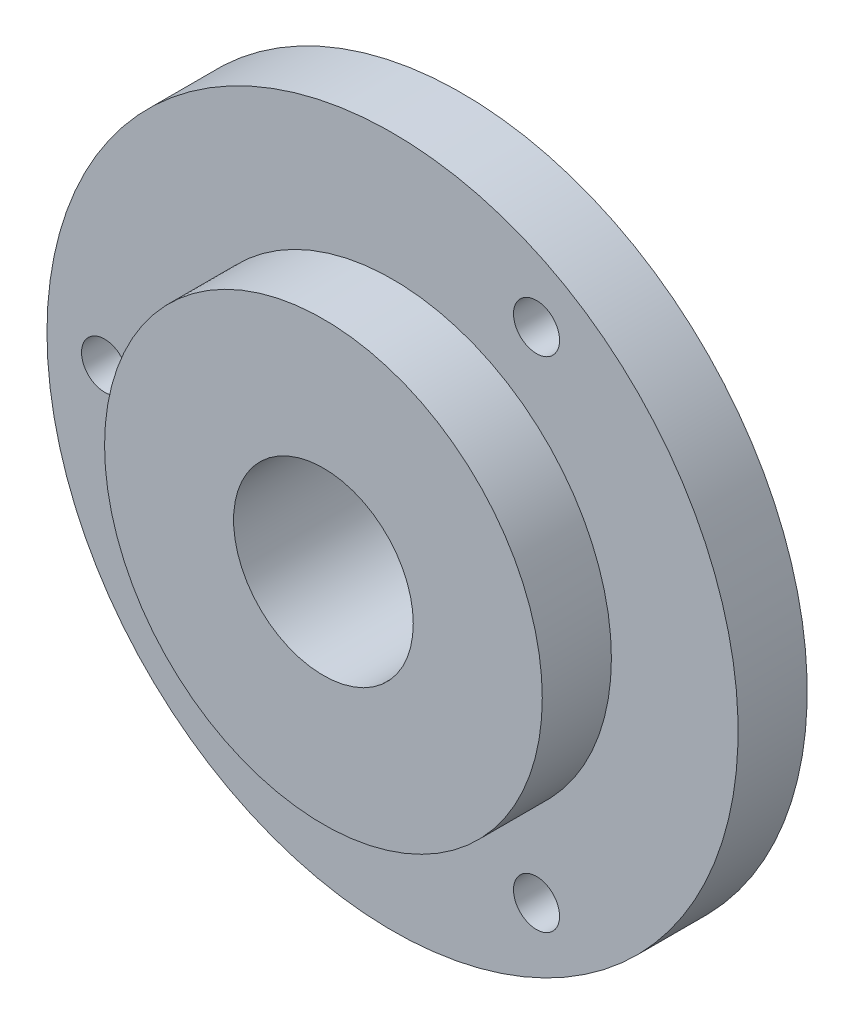
ISO-10303-21;
HEADER;
FILE_DESCRIPTION(('STEP AP214'),'2;1');
FILE_NAME('part.step','',(''),(''),'','','');
FILE_SCHEMA(('AUTOMOTIVE_DESIGN { 1 0 10303 214 1 1 1 1 }'));
ENDSEC;
DATA;
#1=APPLICATION_CONTEXT('core data for automotive mechanical design processes');
#2=APPLICATION_PROTOCOL_DEFINITION('international standard','automotive_design',2000,#1);
#3=PRODUCT_CONTEXT('',#1,'mechanical');
#4=PRODUCT('Part','Part','',(#3));
#5=PRODUCT_RELATED_PRODUCT_CATEGORY('part','',(#4));
#6=PRODUCT_DEFINITION_FORMATION('','',#4);
#7=PRODUCT_DEFINITION_CONTEXT('part definition',#1,'design');
#8=PRODUCT_DEFINITION('design','',#6,#7);
#9=PRODUCT_DEFINITION_SHAPE('','',#8);
#10=(LENGTH_UNIT() NAMED_UNIT(*) SI_UNIT(.MILLI.,.METRE.));
#11=(NAMED_UNIT(*) PLANE_ANGLE_UNIT() SI_UNIT($,.RADIAN.));
#12=(NAMED_UNIT(*) SI_UNIT($,.STERADIAN.) SOLID_ANGLE_UNIT());
#13=UNCERTAINTY_MEASURE_WITH_UNIT(LENGTH_MEASURE(1.E-05),#10,'distance_accuracy_value','');
#14=(GEOMETRIC_REPRESENTATION_CONTEXT(3) GLOBAL_UNCERTAINTY_ASSIGNED_CONTEXT((#13)) GLOBAL_UNIT_ASSIGNED_CONTEXT((#10,
#11,#12)) REPRESENTATION_CONTEXT('',''));
#15=CARTESIAN_POINT('',(0.,0.,0.));
#16=DIRECTION('',(0.,0.,1.));
#17=DIRECTION('',(1.,0.,0.));
#18=AXIS2_PLACEMENT_3D('',#15,#16,#17);
#19=CARTESIAN_POINT('',(0.,0.,3.));
#20=DIRECTION('',(0.,0.,-1.));
#21=DIRECTION('',(-1.,0.,0.));
#22=AXIS2_PLACEMENT_3D('',#19,#20,#21);
#23=CYLINDRICAL_SURFACE('',#22,9.5);
#24=CARTESIAN_POINT('',(0.,0.,3.));
#25=DIRECTION('',(0.,0.,1.));
#26=DIRECTION('',(1.,0.,0.));
#27=AXIS2_PLACEMENT_3D('',#24,#25,#26);
#28=CIRCLE('',#27,9.5);
#29=CARTESIAN_POINT('',(9.5,0.,3.));
#30=VERTEX_POINT('',#29);
#31=EDGE_CURVE('E10',#30,#30,#28,.T.);
#32=ORIENTED_EDGE('',*,*,#31,.F.);
#33=EDGE_LOOP('',(#32));
#34=FACE_BOUND('',#33,.T.);
#35=CARTESIAN_POINT('',(0.,0.,0.));
#36=DIRECTION('',(0.,0.,1.));
#37=DIRECTION('',(1.,0.,0.));
#38=AXIS2_PLACEMENT_3D('',#35,#36,#37);
#39=CIRCLE('',#38,9.5);
#40=CARTESIAN_POINT('',(9.5,0.,0.));
#41=VERTEX_POINT('',#40);
#42=EDGE_CURVE('E36',#41,#41,#39,.T.);
#43=ORIENTED_EDGE('',*,*,#42,.T.);
#44=EDGE_LOOP('',(#43));
#45=FACE_BOUND('',#44,.T.);
#46=ADVANCED_FACE('F33',(#34,#45),#23,.T.);
#47=CARTESIAN_POINT('',(0.,0.,3.));
#48=DIRECTION('',(0.,0.,1.));
#49=DIRECTION('',(1.,0.,0.));
#50=AXIS2_PLACEMENT_3D('',#47,#48,#49);
#51=PLANE('',#50);
#52=CARTESIAN_POINT('',(0.,0.,3.));
#53=DIRECTION('',(0.,0.,1.));
#54=DIRECTION('',(1.,0.,0.));
#55=AXIS2_PLACEMENT_3D('',#52,#53,#54);
#56=CIRCLE('',#55,3.9);
#57=CARTESIAN_POINT('',(3.9,0.,3.));
#58=VERTEX_POINT('',#57);
#59=EDGE_CURVE('E51',#58,#58,#56,.T.);
#60=ORIENTED_EDGE('',*,*,#59,.F.);
#61=EDGE_LOOP('',(#60));
#62=FACE_BOUND('',#61,.T.);
#63=ORIENTED_EDGE('',*,*,#31,.T.);
#64=EDGE_LOOP('',(#63));
#65=FACE_BOUND('',#64,.T.);
#66=ADVANCED_FACE('F100',(#62,#65),#51,.T.);
#67=CARTESIAN_POINT('',(0.,0.,-3.));
#68=DIRECTION('',(0.,0.,1.));
#69=DIRECTION('',(1.,0.,0.));
#70=AXIS2_PLACEMENT_3D('',#67,#68,#69);
#71=CYLINDRICAL_SURFACE('',#70,15.);
#72=CARTESIAN_POINT('',(0.,0.,-3.));
#73=DIRECTION('',(0.,0.,-1.));
#74=DIRECTION('',(-1.,0.,0.));
#75=AXIS2_PLACEMENT_3D('',#72,#73,#74);
#76=CIRCLE('',#75,15.);
#77=CARTESIAN_POINT('',(-15.,0.,-3.));
#78=VERTEX_POINT('',#77);
#79=EDGE_CURVE('E43',#78,#78,#76,.T.);
#80=ORIENTED_EDGE('',*,*,#79,.F.);
#81=EDGE_LOOP('',(#80));
#82=FACE_BOUND('',#81,.T.);
#83=CARTESIAN_POINT('',(0.,0.,0.));
#84=DIRECTION('',(0.,0.,-1.));
#85=DIRECTION('',(-1.,0.,0.));
#86=AXIS2_PLACEMENT_3D('',#83,#84,#85);
#87=CIRCLE('',#86,15.);
#88=CARTESIAN_POINT('',(-15.,0.,0.));
#89=VERTEX_POINT('',#88);
#90=EDGE_CURVE('E45',#89,#89,#87,.T.);
#91=ORIENTED_EDGE('',*,*,#90,.T.);
#92=EDGE_LOOP('',(#91));
#93=FACE_BOUND('',#92,.T.);
#94=ADVANCED_FACE('F98',(#82,#93),#71,.T.);
#95=CARTESIAN_POINT('',(0.,0.,-3.));
#96=DIRECTION('',(0.,0.,-1.));
#97=DIRECTION('',(-1.,0.,0.));
#98=AXIS2_PLACEMENT_3D('',#95,#96,#97);
#99=PLANE('',#98);
#100=CARTESIAN_POINT('',(6.25000000000005,10.8253175473055,-3.));
#101=DIRECTION('',(0.,0.,1.));
#102=DIRECTION('',(-0.500000000000004,-0.866025403784436,0.));
#103=AXIS2_PLACEMENT_3D('',#100,#101,#102);
#104=CIRCLE('',#103,1.);
#105=CARTESIAN_POINT('',(5.75000000000005,9.95929214352102,-3.));
#106=VERTEX_POINT('',#105);
#107=EDGE_CURVE('E66',#106,#106,#104,.T.);
#108=ORIENTED_EDGE('',*,*,#107,.T.);
#109=EDGE_LOOP('',(#108));
#110=FACE_BOUND('',#109,.T.);
#111=CARTESIAN_POINT('',(6.2499999999999,-10.8253175473055,-3.));
#112=DIRECTION('',(0.,0.,1.));
#113=DIRECTION('',(-0.499999999999992,0.866025403784443,0.));
#114=AXIS2_PLACEMENT_3D('',#111,#112,#113);
#115=CIRCLE('',#114,1.);
#116=CARTESIAN_POINT('',(5.74999999999991,-9.9592921435211,-3.));
#117=VERTEX_POINT('',#116);
#118=EDGE_CURVE('E67',#117,#117,#115,.T.);
#119=ORIENTED_EDGE('',*,*,#118,.T.);
#120=EDGE_LOOP('',(#119));
#121=FACE_BOUND('',#120,.T.);
#122=CARTESIAN_POINT('',(-12.5,0.,-3.));
#123=DIRECTION('',(0.,0.,1.));
#124=DIRECTION('',(1.,0.,0.));
#125=AXIS2_PLACEMENT_3D('',#122,#123,#124);
#126=CIRCLE('',#125,1.);
#127=CARTESIAN_POINT('',(-11.5,0.,-3.));
#128=VERTEX_POINT('',#127);
#129=EDGE_CURVE('E54',#128,#128,#126,.T.);
#130=ORIENTED_EDGE('',*,*,#129,.T.);
#131=EDGE_LOOP('',(#130));
#132=FACE_BOUND('',#131,.T.);
#133=CARTESIAN_POINT('',(0.,0.,-3.));
#134=DIRECTION('',(0.,0.,1.));
#135=DIRECTION('',(1.,0.,0.));
#136=AXIS2_PLACEMENT_3D('',#133,#134,#135);
#137=CIRCLE('',#136,3.9);
#138=CARTESIAN_POINT('',(3.9,0.,-3.));
#139=VERTEX_POINT('',#138);
#140=EDGE_CURVE('E48',#139,#139,#137,.T.);
#141=ORIENTED_EDGE('',*,*,#140,.T.);
#142=EDGE_LOOP('',(#141));
#143=FACE_BOUND('',#142,.T.);
#144=ORIENTED_EDGE('',*,*,#79,.T.);
#145=EDGE_LOOP('',(#144));
#146=FACE_BOUND('',#145,.T.);
#147=ADVANCED_FACE('F75',(#110,#121,#132,#143,#146),#99,.T.);
#148=CARTESIAN_POINT('',(0.,0.,0.));
#149=DIRECTION('',(0.,0.,-1.));
#150=DIRECTION('',(-1.,0.,0.));
#151=AXIS2_PLACEMENT_3D('',#148,#149,#150);
#152=PLANE('',#151);
#153=CARTESIAN_POINT('',(6.25000000000005,10.8253175473055,0.));
#154=DIRECTION('',(0.,0.,1.));
#155=DIRECTION('',(-0.500000000000004,-0.866025403784436,0.));
#156=AXIS2_PLACEMENT_3D('',#153,#154,#155);
#157=CIRCLE('',#156,1.);
#158=CARTESIAN_POINT('',(5.75000000000005,9.95929214352102,0.));
#159=VERTEX_POINT('',#158);
#160=EDGE_CURVE('E60',#159,#159,#157,.T.);
#161=ORIENTED_EDGE('',*,*,#160,.F.);
#162=EDGE_LOOP('',(#161));
#163=FACE_BOUND('',#162,.T.);
#164=CARTESIAN_POINT('',(6.2499999999999,-10.8253175473055,0.));
#165=DIRECTION('',(0.,0.,1.));
#166=DIRECTION('',(-0.499999999999992,0.866025403784443,0.));
#167=AXIS2_PLACEMENT_3D('',#164,#165,#166);
#168=CIRCLE('',#167,1.);
#169=CARTESIAN_POINT('',(5.74999999999991,-9.9592921435211,0.));
#170=VERTEX_POINT('',#169);
#171=EDGE_CURVE('E63',#170,#170,#168,.T.);
#172=ORIENTED_EDGE('',*,*,#171,.F.);
#173=EDGE_LOOP('',(#172));
#174=FACE_BOUND('',#173,.T.);
#175=CARTESIAN_POINT('',(-12.5,0.,0.));
#176=DIRECTION('',(0.,0.,1.));
#177=DIRECTION('',(1.,0.,0.));
#178=AXIS2_PLACEMENT_3D('',#175,#176,#177);
#179=CIRCLE('',#178,1.);
#180=CARTESIAN_POINT('',(-11.5,0.,0.));
#181=VERTEX_POINT('',#180);
#182=EDGE_CURVE('E57',#181,#181,#179,.T.);
#183=ORIENTED_EDGE('',*,*,#182,.F.);
#184=EDGE_LOOP('',(#183));
#185=FACE_BOUND('',#184,.T.);
#186=ORIENTED_EDGE('',*,*,#42,.F.);
#187=EDGE_LOOP('',(#186));
#188=FACE_BOUND('',#187,.T.);
#189=ORIENTED_EDGE('',*,*,#90,.F.);
#190=EDGE_LOOP('',(#189));
#191=FACE_BOUND('',#190,.T.);
#192=ADVANCED_FACE('F85',(#163,#174,#185,#188,#191),#152,.F.);
#193=CARTESIAN_POINT('',(0.,0.,-3.));
#194=DIRECTION('',(0.,0.,1.));
#195=DIRECTION('',(1.,0.,0.));
#196=AXIS2_PLACEMENT_3D('',#193,#194,#195);
#197=CYLINDRICAL_SURFACE('',#196,3.9);
#198=ORIENTED_EDGE('',*,*,#140,.F.);
#199=EDGE_LOOP('',(#198));
#200=FACE_BOUND('',#199,.T.);
#201=ORIENTED_EDGE('',*,*,#59,.T.);
#202=EDGE_LOOP('',(#201));
#203=FACE_BOUND('',#202,.T.);
#204=ADVANCED_FACE('F88',(#200,#203),#197,.F.);
#205=CARTESIAN_POINT('',(-12.5,0.,-3.));
#206=DIRECTION('',(0.,0.,1.));
#207=DIRECTION('',(1.,0.,0.));
#208=AXIS2_PLACEMENT_3D('',#205,#206,#207);
#209=CYLINDRICAL_SURFACE('',#208,1.);
#210=ORIENTED_EDGE('',*,*,#129,.F.);
#211=EDGE_LOOP('',(#210));
#212=FACE_BOUND('',#211,.T.);
#213=ORIENTED_EDGE('',*,*,#182,.T.);
#214=EDGE_LOOP('',(#213));
#215=FACE_BOUND('',#214,.T.);
#216=ADVANCED_FACE('F130',(#212,#215),#209,.F.);
#217=CARTESIAN_POINT('',(6.2499999999999,-10.8253175473055,-3.));
#218=DIRECTION('',(0.,0.,1.));
#219=DIRECTION('',(-0.499999999999992,0.866025403784443,0.));
#220=AXIS2_PLACEMENT_3D('',#217,#218,#219);
#221=CYLINDRICAL_SURFACE('',#220,1.);
#222=ORIENTED_EDGE('',*,*,#118,.F.);
#223=EDGE_LOOP('',(#222));
#224=FACE_BOUND('',#223,.T.);
#225=ORIENTED_EDGE('',*,*,#171,.T.);
#226=EDGE_LOOP('',(#225));
#227=FACE_BOUND('',#226,.T.);
#228=ADVANCED_FACE('F81',(#224,#227),#221,.F.);
#229=CARTESIAN_POINT('',(6.25000000000005,10.8253175473055,-3.));
#230=DIRECTION('',(0.,0.,1.));
#231=DIRECTION('',(-0.500000000000004,-0.866025403784436,0.));
#232=AXIS2_PLACEMENT_3D('',#229,#230,#231);
#233=CYLINDRICAL_SURFACE('',#232,1.);
#234=ORIENTED_EDGE('',*,*,#107,.F.);
#235=EDGE_LOOP('',(#234));
#236=FACE_BOUND('',#235,.T.);
#237=ORIENTED_EDGE('',*,*,#160,.T.);
#238=EDGE_LOOP('',(#237));
#239=FACE_BOUND('',#238,.T.);
#240=ADVANCED_FACE('F78',(#236,#239),#233,.F.);
#241=CLOSED_SHELL('',(#46,#66,#94,#147,#192,#204,#216,#228,#240));
#242=MANIFOLD_SOLID_BREP('B2',#241);
#243=ADVANCED_BREP_SHAPE_REPRESENTATION('',(#18,#242),#14);
#244=SHAPE_DEFINITION_REPRESENTATION(#9,#243);
ENDSEC;
END-ISO-10303-21;
